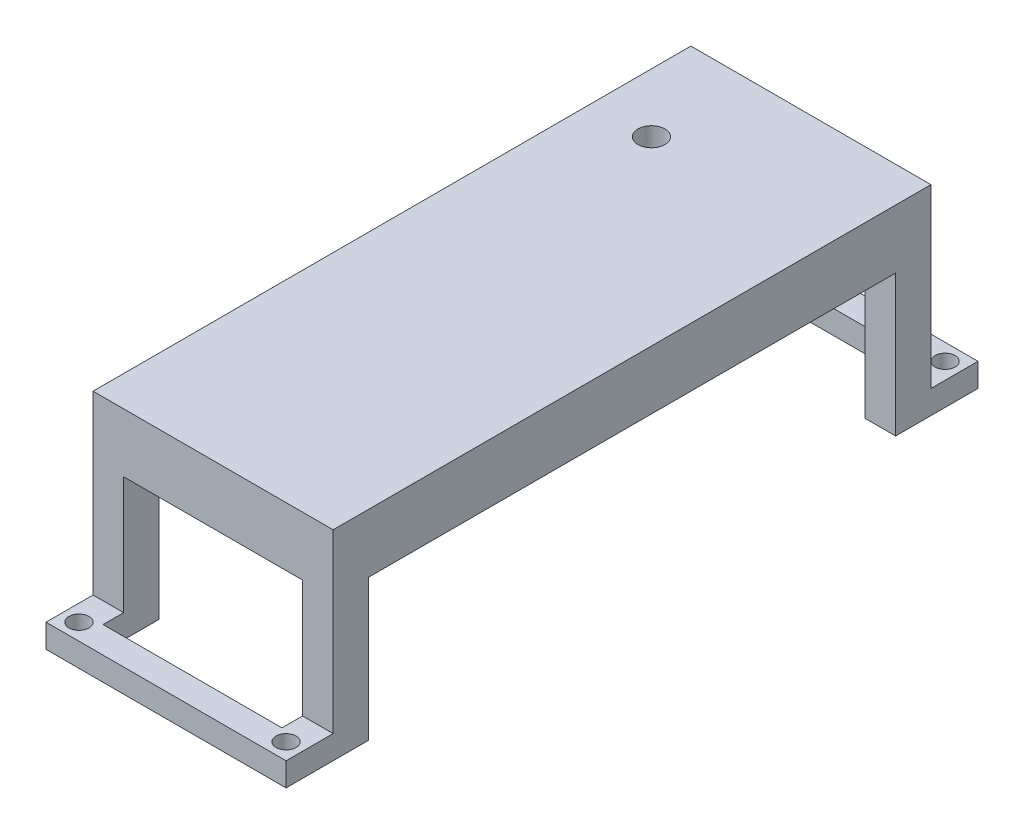
ISO-10303-21;
HEADER;
FILE_DESCRIPTION(('STEP AP214'),'2;1');
FILE_NAME('part.step','',(''),(''),'','','');
FILE_SCHEMA(('AUTOMOTIVE_DESIGN { 1 0 10303 214 1 1 1 1 }'));
ENDSEC;
DATA;
#1=APPLICATION_CONTEXT('core data for automotive mechanical design processes');
#2=APPLICATION_PROTOCOL_DEFINITION('international standard','automotive_design',2000,#1);
#3=PRODUCT_CONTEXT('',#1,'mechanical');
#4=PRODUCT('Part','Part','',(#3));
#5=PRODUCT_RELATED_PRODUCT_CATEGORY('part','',(#4));
#6=PRODUCT_DEFINITION_FORMATION('','',#4);
#7=PRODUCT_DEFINITION_CONTEXT('part definition',#1,'design');
#8=PRODUCT_DEFINITION('design','',#6,#7);
#9=PRODUCT_DEFINITION_SHAPE('','',#8);
#10=(LENGTH_UNIT() NAMED_UNIT(*) SI_UNIT(.MILLI.,.METRE.));
#11=(NAMED_UNIT(*) PLANE_ANGLE_UNIT() SI_UNIT($,.RADIAN.));
#12=(NAMED_UNIT(*) SI_UNIT($,.STERADIAN.) SOLID_ANGLE_UNIT());
#13=UNCERTAINTY_MEASURE_WITH_UNIT(LENGTH_MEASURE(1.E-05),#10,'distance_accuracy_value','');
#14=(GEOMETRIC_REPRESENTATION_CONTEXT(3) GLOBAL_UNCERTAINTY_ASSIGNED_CONTEXT((#13)) GLOBAL_UNIT_ASSIGNED_CONTEXT((#10,
#11,#12)) REPRESENTATION_CONTEXT('',''));
#15=CARTESIAN_POINT('',(0.,0.,0.));
#16=DIRECTION('',(0.,0.,1.));
#17=DIRECTION('',(1.,0.,0.));
#18=AXIS2_PLACEMENT_3D('',#15,#16,#17);
#19=CARTESIAN_POINT('',(0.,0.,23.75));
#20=DIRECTION('',(0.,0.,1.));
#21=DIRECTION('',(1.,0.,0.));
#22=AXIS2_PLACEMENT_3D('',#19,#20,#21);
#23=PLANE('',#22);
#24=DIRECTION('',(1.,0.,0.));
#25=VECTOR('',#24,1.);
#26=CARTESIAN_POINT('',(-51.,60.,23.75));
#27=LINE('',#26,#25);
#28=CARTESIAN_POINT('',(-51.,60.,23.75));
#29=VERTEX_POINT('',#28);
#30=CARTESIAN_POINT('',(-38.,60.,23.75));
#31=VERTEX_POINT('',#30);
#32=EDGE_CURVE('E327',#29,#31,#27,.T.);
#33=ORIENTED_EDGE('',*,*,#32,.F.);
#34=DIRECTION('',(0.,1.,0.));
#35=VECTOR('',#34,1.);
#36=CARTESIAN_POINT('',(-51.,0.,23.75));
#37=LINE('',#36,#35);
#38=CARTESIAN_POINT('',(-51.,0.,23.75));
#39=VERTEX_POINT('',#38);
#40=EDGE_CURVE('E376',#39,#29,#37,.T.);
#41=ORIENTED_EDGE('',*,*,#40,.F.);
#42=DIRECTION('',(1.,0.,0.));
#43=VECTOR('',#42,1.);
#44=CARTESIAN_POINT('',(0.,0.,23.75));
#45=LINE('',#44,#43);
#46=CARTESIAN_POINT('',(-38.,0.,23.75));
#47=VERTEX_POINT('',#46);
#48=EDGE_CURVE('E380',#39,#47,#45,.T.);
#49=ORIENTED_EDGE('',*,*,#48,.T.);
#50=DIRECTION('',(0.,1.,0.));
#51=VECTOR('',#50,1.);
#52=CARTESIAN_POINT('',(-38.,0.,23.75));
#53=LINE('',#52,#51);
#54=EDGE_CURVE('E384',#47,#31,#53,.T.);
#55=ORIENTED_EDGE('',*,*,#54,.T.);
#56=EDGE_LOOP('',(#33,#41,#49,#55));
#57=FACE_BOUND('',#56,.T.);
#58=ADVANCED_FACE('F41',(#57),#23,.T.);
#59=CARTESIAN_POINT('',(0.,10.,0.));
#60=DIRECTION('',(0.,1.,0.));
#61=DIRECTION('',(0.,0.,1.));
#62=AXIS2_PLACEMENT_3D('',#59,#60,#61);
#63=PLANE('',#62);
#64=CARTESIAN_POINT('',(-44.,10.,-4.25000000000001));
#65=DIRECTION('',(0.,1.,0.));
#66=DIRECTION('',(0.,0.,1.));
#67=AXIS2_PLACEMENT_3D('',#64,#65,#66);
#68=CIRCLE('',#67,4.25000000000001);
#69=CARTESIAN_POINT('',(-44.,10.,0.));
#70=VERTEX_POINT('',#69);
#71=EDGE_CURVE('E415',#70,#70,#68,.T.);
#72=ORIENTED_EDGE('',*,*,#71,.F.);
#73=EDGE_LOOP('',(#72));
#74=FACE_BOUND('',#73,.T.);
#75=CARTESIAN_POINT('',(44.,10.,-4.25000000000001));
#76=DIRECTION('',(0.,1.,0.));
#77=DIRECTION('',(0.,0.,-1.));
#78=AXIS2_PLACEMENT_3D('',#75,#76,#77);
#79=CIRCLE('',#78,4.25000000000001);
#80=CARTESIAN_POINT('',(44.,10.,-8.50000000000001));
#81=VERTEX_POINT('',#80);
#82=EDGE_CURVE('E406',#81,#81,#79,.T.);
#83=ORIENTED_EDGE('',*,*,#82,.F.);
#84=EDGE_LOOP('',(#83));
#85=FACE_BOUND('',#84,.T.);
#86=DIRECTION('',(0.,0.,1.));
#87=VECTOR('',#86,1.);
#88=CARTESIAN_POINT('',(-51.,10.,-11.25));
#89=LINE('',#88,#87);
#90=CARTESIAN_POINT('',(-51.,10.,-11.25));
#91=VERTEX_POINT('',#90);
#92=CARTESIAN_POINT('',(-51.,10.,8.74999999999998));
#93=VERTEX_POINT('',#92);
#94=EDGE_CURVE('E423',#91,#93,#89,.T.);
#95=ORIENTED_EDGE('',*,*,#94,.T.);
#96=DIRECTION('',(1.,0.,0.));
#97=VECTOR('',#96,1.);
#98=CARTESIAN_POINT('',(0.,10.,8.74999999999998));
#99=LINE('',#98,#97);
#100=CARTESIAN_POINT('',(-38.,10.,8.74999999999998));
#101=VERTEX_POINT('',#100);
#102=EDGE_CURVE('E405',#93,#101,#99,.T.);
#103=ORIENTED_EDGE('',*,*,#102,.T.);
#104=DIRECTION('',(0.,0.,-1.));
#105=VECTOR('',#104,1.);
#106=CARTESIAN_POINT('',(-38.,10.,13.75));
#107=LINE('',#106,#105);
#108=CARTESIAN_POINT('',(-38.,10.,0.));
#109=VERTEX_POINT('',#108);
#110=EDGE_CURVE('E427',#101,#109,#107,.T.);
#111=ORIENTED_EDGE('',*,*,#110,.T.);
#112=DIRECTION('',(1.,0.,0.));
#113=VECTOR('',#112,1.);
#114=CARTESIAN_POINT('',(-38.,10.,0.));
#115=LINE('',#114,#113);
#116=CARTESIAN_POINT('',(38.,10.,0.));
#117=VERTEX_POINT('',#116);
#118=EDGE_CURVE('E431',#109,#117,#115,.T.);
#119=ORIENTED_EDGE('',*,*,#118,.T.);
#120=DIRECTION('',(0.,0.,1.));
#121=VECTOR('',#120,1.);
#122=CARTESIAN_POINT('',(38.,10.,13.75));
#123=LINE('',#122,#121);
#124=CARTESIAN_POINT('',(38.,10.,8.74999999999998));
#125=VERTEX_POINT('',#124);
#126=EDGE_CURVE('E434',#117,#125,#123,.T.);
#127=ORIENTED_EDGE('',*,*,#126,.T.);
#128=CARTESIAN_POINT('',(51.,10.,8.74999999999998));
#129=VERTEX_POINT('',#128);
#130=EDGE_CURVE('E401',#125,#129,#99,.T.);
#131=ORIENTED_EDGE('',*,*,#130,.T.);
#132=DIRECTION('',(0.,0.,-1.));
#133=VECTOR('',#132,1.);
#134=CARTESIAN_POINT('',(51.,10.,0.));
#135=LINE('',#134,#133);
#136=CARTESIAN_POINT('',(51.,10.,-11.25));
#137=VERTEX_POINT('',#136);
#138=EDGE_CURVE('E438',#129,#137,#135,.T.);
#139=ORIENTED_EDGE('',*,*,#138,.T.);
#140=DIRECTION('',(-1.,0.,0.));
#141=VECTOR('',#140,1.);
#142=CARTESIAN_POINT('',(-51.,10.,-11.25));
#143=LINE('',#142,#141);
#144=EDGE_CURVE('E441',#137,#91,#143,.T.);
#145=ORIENTED_EDGE('',*,*,#144,.T.);
#146=EDGE_LOOP('',(#95,#103,#111,#119,#127,#131,#139,#145));
#147=FACE_BOUND('',#146,.T.);
#148=ADVANCED_FACE('F502',(#74,#85,#147),#63,.T.);
#149=CARTESIAN_POINT('',(0.,0.,0.));
#150=DIRECTION('',(0.,1.,0.));
#151=DIRECTION('',(0.,0.,1.));
#152=AXIS2_PLACEMENT_3D('',#149,#150,#151);
#153=PLANE('',#152);
#154=DIRECTION('',(1.,0.,0.));
#155=VECTOR('',#154,1.);
#156=CARTESIAN_POINT('',(0.,0.,23.75));
#157=LINE('',#156,#155);
#158=CARTESIAN_POINT('',(38.,0.,23.75));
#159=VERTEX_POINT('',#158);
#160=CARTESIAN_POINT('',(51.,0.,23.75));
#161=VERTEX_POINT('',#160);
#162=EDGE_CURVE('E369',#159,#161,#157,.T.);
#163=ORIENTED_EDGE('',*,*,#162,.F.);
#164=DIRECTION('',(0.,0.,1.));
#165=VECTOR('',#164,1.);
#166=CARTESIAN_POINT('',(38.,0.,13.75));
#167=LINE('',#166,#165);
#168=CARTESIAN_POINT('',(38.,0.,0.));
#169=VERTEX_POINT('',#168);
#170=EDGE_CURVE('E453',#169,#159,#167,.T.);
#171=ORIENTED_EDGE('',*,*,#170,.F.);
#172=DIRECTION('',(1.,0.,0.));
#173=VECTOR('',#172,1.);
#174=CARTESIAN_POINT('',(-38.,0.,0.));
#175=LINE('',#174,#173);
#176=CARTESIAN_POINT('',(-38.,0.,0.));
#177=VERTEX_POINT('',#176);
#178=EDGE_CURVE('E450',#177,#169,#175,.T.);
#179=ORIENTED_EDGE('',*,*,#178,.F.);
#180=DIRECTION('',(0.,0.,-1.));
#181=VECTOR('',#180,1.);
#182=CARTESIAN_POINT('',(-38.,0.,13.75));
#183=LINE('',#182,#181);
#184=EDGE_CURVE('E447',#47,#177,#183,.T.);
#185=ORIENTED_EDGE('',*,*,#184,.F.);
#186=ORIENTED_EDGE('',*,*,#48,.F.);
#187=DIRECTION('',(0.,0.,1.));
#188=VECTOR('',#187,1.);
#189=CARTESIAN_POINT('',(-51.,0.,-11.25));
#190=LINE('',#189,#188);
#191=CARTESIAN_POINT('',(-51.,0.,-11.25));
#192=VERTEX_POINT('',#191);
#193=EDGE_CURVE('E419',#192,#39,#190,.T.);
#194=ORIENTED_EDGE('',*,*,#193,.F.);
#195=DIRECTION('',(-1.,0.,0.));
#196=VECTOR('',#195,1.);
#197=CARTESIAN_POINT('',(-51.,0.,-11.25));
#198=LINE('',#197,#196);
#199=CARTESIAN_POINT('',(51.,0.,-11.25));
#200=VERTEX_POINT('',#199);
#201=EDGE_CURVE('E428',#200,#192,#198,.T.);
#202=ORIENTED_EDGE('',*,*,#201,.F.);
#203=DIRECTION('',(0.,0.,-1.));
#204=VECTOR('',#203,1.);
#205=CARTESIAN_POINT('',(51.,0.,-11.25));
#206=LINE('',#205,#204);
#207=EDGE_CURVE('E456',#161,#200,#206,.T.);
#208=ORIENTED_EDGE('',*,*,#207,.F.);
#209=EDGE_LOOP('',(#163,#171,#179,#185,#186,#194,#202,#208));
#210=FACE_BOUND('',#209,.T.);
#211=CARTESIAN_POINT('',(-44.,0.,-4.25000000000001));
#212=DIRECTION('',(0.,1.,0.));
#213=DIRECTION('',(0.,0.,1.));
#214=AXIS2_PLACEMENT_3D('',#211,#212,#213);
#215=CIRCLE('',#214,4.25000000000001);
#216=CARTESIAN_POINT('',(-44.,0.,0.));
#217=VERTEX_POINT('',#216);
#218=EDGE_CURVE('E410',#217,#217,#215,.T.);
#219=ORIENTED_EDGE('',*,*,#218,.T.);
#220=EDGE_LOOP('',(#219));
#221=FACE_BOUND('',#220,.T.);
#222=CARTESIAN_POINT('',(44.,0.,-4.25000000000001));
#223=DIRECTION('',(0.,1.,0.));
#224=DIRECTION('',(0.,0.,-1.));
#225=AXIS2_PLACEMENT_3D('',#222,#223,#224);
#226=CIRCLE('',#225,4.25000000000001);
#227=CARTESIAN_POINT('',(44.,0.,-8.50000000000001));
#228=VERTEX_POINT('',#227);
#229=EDGE_CURVE('E411',#228,#228,#226,.T.);
#230=ORIENTED_EDGE('',*,*,#229,.T.);
#231=EDGE_LOOP('',(#230));
#232=FACE_BOUND('',#231,.T.);
#233=ADVANCED_FACE('F514',(#210,#221,#232),#153,.F.);
#234=CARTESIAN_POINT('',(-51.,10.,-11.25));
#235=DIRECTION('',(1.,0.,0.));
#236=DIRECTION('',(0.,0.,-1.));
#237=AXIS2_PLACEMENT_3D('',#234,#235,#236);
#238=PLANE('',#237);
#239=DIRECTION('',(0.,0.,1.));
#240=VECTOR('',#239,1.);
#241=CARTESIAN_POINT('',(-51.,0.,247.75));
#242=LINE('',#241,#240);
#243=CARTESIAN_POINT('',(-51.,0.,247.75));
#244=VERTEX_POINT('',#243);
#245=CARTESIAN_POINT('',(-51.,0.,282.75));
#246=VERTEX_POINT('',#245);
#247=EDGE_CURVE('E203',#244,#246,#242,.T.);
#248=ORIENTED_EDGE('',*,*,#247,.T.);
#249=DIRECTION('',(0.,-1.,0.));
#250=VECTOR('',#249,1.);
#251=CARTESIAN_POINT('',(-51.,10.,282.75));
#252=LINE('',#251,#250);
#253=CARTESIAN_POINT('',(-51.,10.,282.75));
#254=VERTEX_POINT('',#253);
#255=EDGE_CURVE('E199',#254,#246,#252,.T.);
#256=ORIENTED_EDGE('',*,*,#255,.F.);
#257=DIRECTION('',(0.,0.,-1.));
#258=VECTOR('',#257,1.);
#259=CARTESIAN_POINT('',(-51.,10.,282.75));
#260=LINE('',#259,#258);
#261=CARTESIAN_POINT('',(-51.,10.,262.75));
#262=VERTEX_POINT('',#261);
#263=EDGE_CURVE('E201',#254,#262,#260,.T.);
#264=ORIENTED_EDGE('',*,*,#263,.T.);
#265=DIRECTION('',(0.,1.,0.));
#266=VECTOR('',#265,1.);
#267=CARTESIAN_POINT('',(-51.,0.,262.75));
#268=LINE('',#267,#266);
#269=CARTESIAN_POINT('',(-51.,85.,262.75));
#270=VERTEX_POINT('',#269);
#271=EDGE_CURVE('E60',#262,#270,#268,.T.);
#272=ORIENTED_EDGE('',*,*,#271,.T.);
#273=DIRECTION('',(0.,0.,-1.));
#274=VECTOR('',#273,1.);
#275=CARTESIAN_POINT('',(-51.,85.,23.75));
#276=LINE('',#275,#274);
#277=CARTESIAN_POINT('',(-51.,85.,8.74999999999998));
#278=VERTEX_POINT('',#277);
#279=EDGE_CURVE('E394',#270,#278,#276,.T.);
#280=ORIENTED_EDGE('',*,*,#279,.T.);
#281=DIRECTION('',(0.,1.,0.));
#282=VECTOR('',#281,1.);
#283=CARTESIAN_POINT('',(-51.,0.,8.74999999999998));
#284=LINE('',#283,#282);
#285=EDGE_CURVE('E355',#93,#278,#284,.T.);
#286=ORIENTED_EDGE('',*,*,#285,.F.);
#287=ORIENTED_EDGE('',*,*,#94,.F.);
#288=DIRECTION('',(0.,-1.,0.));
#289=VECTOR('',#288,1.);
#290=CARTESIAN_POINT('',(-51.,10.,-11.25));
#291=LINE('',#290,#289);
#292=EDGE_CURVE('E444',#91,#192,#291,.T.);
#293=ORIENTED_EDGE('',*,*,#292,.T.);
#294=ORIENTED_EDGE('',*,*,#193,.T.);
#295=ORIENTED_EDGE('',*,*,#40,.T.);
#296=DIRECTION('',(0.,0.,-1.));
#297=VECTOR('',#296,1.);
#298=CARTESIAN_POINT('',(-51.,60.,247.75));
#299=LINE('',#298,#297);
#300=CARTESIAN_POINT('',(-51.,60.,247.75));
#301=VERTEX_POINT('',#300);
#302=EDGE_CURVE('E340',#301,#29,#299,.T.);
#303=ORIENTED_EDGE('',*,*,#302,.F.);
#304=DIRECTION('',(0.,1.,0.));
#305=VECTOR('',#304,1.);
#306=CARTESIAN_POINT('',(-51.,0.,247.75));
#307=LINE('',#306,#305);
#308=EDGE_CURVE('E290',#244,#301,#307,.T.);
#309=ORIENTED_EDGE('',*,*,#308,.F.);
#310=EDGE_LOOP('',(#248,#256,#264,#272,#280,#286,#287,#293,#294,#295,#303,#309));
#311=FACE_BOUND('',#310,.T.);
#312=ADVANCED_FACE('F43',(#311),#238,.F.);
#313=CARTESIAN_POINT('',(-38.,10.,13.75));
#314=DIRECTION('',(-1.,0.,0.));
#315=DIRECTION('',(0.,0.,1.));
#316=AXIS2_PLACEMENT_3D('',#313,#314,#315);
#317=PLANE('',#316);
#318=ORIENTED_EDGE('',*,*,#110,.F.);
#319=DIRECTION('',(0.,1.,0.));
#320=VECTOR('',#319,1.);
#321=CARTESIAN_POINT('',(-38.,0.,8.74999999999998));
#322=LINE('',#321,#320);
#323=CARTESIAN_POINT('',(-38.,60.,8.74999999999998));
#324=VERTEX_POINT('',#323);
#325=EDGE_CURVE('E358',#101,#324,#322,.T.);
#326=ORIENTED_EDGE('',*,*,#325,.T.);
#327=DIRECTION('',(0.,0.,-1.));
#328=VECTOR('',#327,1.);
#329=CARTESIAN_POINT('',(-38.,60.,23.75));
#330=LINE('',#329,#328);
#331=EDGE_CURVE('E390',#31,#324,#330,.T.);
#332=ORIENTED_EDGE('',*,*,#331,.F.);
#333=ORIENTED_EDGE('',*,*,#54,.F.);
#334=ORIENTED_EDGE('',*,*,#184,.T.);
#335=DIRECTION('',(0.,-1.,0.));
#336=VECTOR('',#335,1.);
#337=CARTESIAN_POINT('',(-38.,10.,0.));
#338=LINE('',#337,#336);
#339=EDGE_CURVE('E471',#109,#177,#338,.T.);
#340=ORIENTED_EDGE('',*,*,#339,.F.);
#341=EDGE_LOOP('',(#318,#326,#332,#333,#334,#340));
#342=FACE_BOUND('',#341,.T.);
#343=ADVANCED_FACE('F586',(#342),#317,.F.);
#344=CARTESIAN_POINT('',(-38.,10.,0.));
#345=DIRECTION('',(0.,0.,-1.));
#346=DIRECTION('',(-1.,0.,0.));
#347=AXIS2_PLACEMENT_3D('',#344,#345,#346);
#348=PLANE('',#347);
#349=ORIENTED_EDGE('',*,*,#178,.T.);
#350=DIRECTION('',(0.,-1.,0.));
#351=VECTOR('',#350,1.);
#352=CARTESIAN_POINT('',(38.,10.,0.));
#353=LINE('',#352,#351);
#354=EDGE_CURVE('E468',#117,#169,#353,.T.);
#355=ORIENTED_EDGE('',*,*,#354,.F.);
#356=ORIENTED_EDGE('',*,*,#118,.F.);
#357=ORIENTED_EDGE('',*,*,#339,.T.);
#358=EDGE_LOOP('',(#349,#355,#356,#357));
#359=FACE_BOUND('',#358,.T.);
#360=ADVANCED_FACE('F584',(#359),#348,.F.);
#361=CARTESIAN_POINT('',(38.,10.,13.75));
#362=DIRECTION('',(1.,0.,0.));
#363=DIRECTION('',(0.,0.,-1.));
#364=AXIS2_PLACEMENT_3D('',#361,#362,#363);
#365=PLANE('',#364);
#366=DIRECTION('',(0.,-1.,0.));
#367=VECTOR('',#366,1.);
#368=CARTESIAN_POINT('',(38.,0.,8.74999999999998));
#369=LINE('',#368,#367);
#370=CARTESIAN_POINT('',(38.,60.,8.74999999999998));
#371=VERTEX_POINT('',#370);
#372=EDGE_CURVE('E344',#371,#125,#369,.T.);
#373=ORIENTED_EDGE('',*,*,#372,.T.);
#374=ORIENTED_EDGE('',*,*,#126,.F.);
#375=ORIENTED_EDGE('',*,*,#354,.T.);
#376=ORIENTED_EDGE('',*,*,#170,.T.);
#377=DIRECTION('',(0.,-1.,0.));
#378=VECTOR('',#377,1.);
#379=CARTESIAN_POINT('',(38.,0.,23.75));
#380=LINE('',#379,#378);
#381=CARTESIAN_POINT('',(38.,60.,23.75));
#382=VERTEX_POINT('',#381);
#383=EDGE_CURVE('E365',#382,#159,#380,.T.);
#384=ORIENTED_EDGE('',*,*,#383,.F.);
#385=DIRECTION('',(0.,0.,-1.));
#386=VECTOR('',#385,1.);
#387=CARTESIAN_POINT('',(38.,60.,23.75));
#388=LINE('',#387,#386);
#389=EDGE_CURVE('E387',#382,#371,#388,.T.);
#390=ORIENTED_EDGE('',*,*,#389,.T.);
#391=EDGE_LOOP('',(#373,#374,#375,#376,#384,#390));
#392=FACE_BOUND('',#391,.T.);
#393=ADVANCED_FACE('F580',(#392),#365,.F.);
#394=CARTESIAN_POINT('',(51.,10.,-11.25));
#395=DIRECTION('',(-1.,0.,0.));
#396=DIRECTION('',(0.,0.,1.));
#397=AXIS2_PLACEMENT_3D('',#394,#395,#396);
#398=PLANE('',#397);
#399=DIRECTION('',(0.,-1.,0.));
#400=VECTOR('',#399,1.);
#401=CARTESIAN_POINT('',(51.,10.,282.75));
#402=LINE('',#401,#400);
#403=CARTESIAN_POINT('',(51.,10.,282.75));
#404=VERTEX_POINT('',#403);
#405=CARTESIAN_POINT('',(51.,0.,282.75));
#406=VERTEX_POINT('',#405);
#407=EDGE_CURVE('E210',#404,#406,#402,.T.);
#408=ORIENTED_EDGE('',*,*,#407,.T.);
#409=DIRECTION('',(0.,0.,1.));
#410=VECTOR('',#409,1.);
#411=CARTESIAN_POINT('',(51.,0.,247.75));
#412=LINE('',#411,#410);
#413=CARTESIAN_POINT('',(51.,0.,247.75));
#414=VERTEX_POINT('',#413);
#415=EDGE_CURVE('E304',#414,#406,#412,.T.);
#416=ORIENTED_EDGE('',*,*,#415,.F.);
#417=DIRECTION('',(0.,-1.,0.));
#418=VECTOR('',#417,1.);
#419=CARTESIAN_POINT('',(51.,0.,247.75));
#420=LINE('',#419,#418);
#421=CARTESIAN_POINT('',(51.,60.,247.75));
#422=VERTEX_POINT('',#421);
#423=EDGE_CURVE('E294',#422,#414,#420,.T.);
#424=ORIENTED_EDGE('',*,*,#423,.F.);
#425=DIRECTION('',(0.,0.,-1.));
#426=VECTOR('',#425,1.);
#427=CARTESIAN_POINT('',(51.,60.,247.75));
#428=LINE('',#427,#426);
#429=CARTESIAN_POINT('',(51.,60.,23.75));
#430=VERTEX_POINT('',#429);
#431=EDGE_CURVE('E331',#422,#430,#428,.T.);
#432=ORIENTED_EDGE('',*,*,#431,.T.);
#433=DIRECTION('',(0.,-1.,0.));
#434=VECTOR('',#433,1.);
#435=CARTESIAN_POINT('',(51.,0.,23.75));
#436=LINE('',#435,#434);
#437=EDGE_CURVE('E373',#430,#161,#436,.T.);
#438=ORIENTED_EDGE('',*,*,#437,.T.);
#439=ORIENTED_EDGE('',*,*,#207,.T.);
#440=DIRECTION('',(0.,-1.,0.));
#441=VECTOR('',#440,1.);
#442=CARTESIAN_POINT('',(51.,10.,-11.25));
#443=LINE('',#442,#441);
#444=EDGE_CURVE('E464',#137,#200,#443,.T.);
#445=ORIENTED_EDGE('',*,*,#444,.F.);
#446=ORIENTED_EDGE('',*,*,#138,.F.);
#447=DIRECTION('',(0.,-1.,0.));
#448=VECTOR('',#447,1.);
#449=CARTESIAN_POINT('',(51.,0.,8.74999999999998));
#450=LINE('',#449,#448);
#451=CARTESIAN_POINT('',(51.,85.,8.74999999999998));
#452=VERTEX_POINT('',#451);
#453=EDGE_CURVE('E348',#452,#129,#450,.T.);
#454=ORIENTED_EDGE('',*,*,#453,.F.);
#455=DIRECTION('',(0.,0.,-1.));
#456=VECTOR('',#455,1.);
#457=CARTESIAN_POINT('',(51.,85.,23.75));
#458=LINE('',#457,#456);
#459=CARTESIAN_POINT('',(51.,85.,262.75));
#460=VERTEX_POINT('',#459);
#461=EDGE_CURVE('E398',#460,#452,#458,.T.);
#462=ORIENTED_EDGE('',*,*,#461,.F.);
#463=DIRECTION('',(0.,-1.,0.));
#464=VECTOR('',#463,1.);
#465=CARTESIAN_POINT('',(51.,0.,262.75));
#466=LINE('',#465,#464);
#467=CARTESIAN_POINT('',(51.,10.,262.75));
#468=VERTEX_POINT('',#467);
#469=EDGE_CURVE('E274',#460,#468,#466,.T.);
#470=ORIENTED_EDGE('',*,*,#469,.T.);
#471=DIRECTION('',(0.,0.,1.));
#472=VECTOR('',#471,1.);
#473=CARTESIAN_POINT('',(51.,10.,282.75));
#474=LINE('',#473,#472);
#475=EDGE_CURVE('E225',#468,#404,#474,.T.);
#476=ORIENTED_EDGE('',*,*,#475,.T.);
#477=EDGE_LOOP('',(#408,#416,#424,#432,#438,#439,#445,#446,#454,#462,#470,#476));
#478=FACE_BOUND('',#477,.T.);
#479=ADVANCED_FACE('F489',(#478),#398,.F.);
#480=CARTESIAN_POINT('',(-51.,10.,-11.25));
#481=DIRECTION('',(0.,0.,1.));
#482=DIRECTION('',(1.,0.,0.));
#483=AXIS2_PLACEMENT_3D('',#480,#481,#482);
#484=PLANE('',#483);
#485=ORIENTED_EDGE('',*,*,#201,.T.);
#486=ORIENTED_EDGE('',*,*,#292,.F.);
#487=ORIENTED_EDGE('',*,*,#144,.F.);
#488=ORIENTED_EDGE('',*,*,#444,.T.);
#489=EDGE_LOOP('',(#485,#486,#487,#488));
#490=FACE_BOUND('',#489,.T.);
#491=ADVANCED_FACE('F508',(#490),#484,.F.);
#492=CARTESIAN_POINT('',(-44.,10.,-4.25000000000001));
#493=DIRECTION('',(0.,-1.,0.));
#494=DIRECTION('',(0.,0.,-1.));
#495=AXIS2_PLACEMENT_3D('',#492,#493,#494);
#496=CYLINDRICAL_SURFACE('',#495,4.25000000000001);
#497=ORIENTED_EDGE('',*,*,#71,.T.);
#498=EDGE_LOOP('',(#497));
#499=FACE_BOUND('',#498,.T.);
#500=ORIENTED_EDGE('',*,*,#218,.F.);
#501=EDGE_LOOP('',(#500));
#502=FACE_BOUND('',#501,.T.);
#503=ADVANCED_FACE('F601',(#499,#502),#496,.F.);
#504=CARTESIAN_POINT('',(44.,10.,-4.25000000000001));
#505=DIRECTION('',(0.,-1.,0.));
#506=DIRECTION('',(0.,0.,-1.));
#507=AXIS2_PLACEMENT_3D('',#504,#505,#506);
#508=CYLINDRICAL_SURFACE('',#507,4.25000000000001);
#509=ORIENTED_EDGE('',*,*,#82,.T.);
#510=EDGE_LOOP('',(#509));
#511=FACE_BOUND('',#510,.T.);
#512=ORIENTED_EDGE('',*,*,#229,.F.);
#513=EDGE_LOOP('',(#512));
#514=FACE_BOUND('',#513,.T.);
#515=ADVANCED_FACE('F606',(#511,#514),#508,.F.);
#516=CARTESIAN_POINT('',(0.,85.,23.75));
#517=DIRECTION('',(0.,1.,0.));
#518=DIRECTION('',(0.,0.,1.));
#519=AXIS2_PLACEMENT_3D('',#516,#517,#518);
#520=PLANE('',#519);
#521=CARTESIAN_POINT('',(-26.,85.,50.5));
#522=DIRECTION('',(0.,1.,0.));
#523=DIRECTION('',(0.,0.,1.));
#524=AXIS2_PLACEMENT_3D('',#521,#522,#523);
#525=CIRCLE('',#524,5.74999999999999);
#526=CARTESIAN_POINT('',(-26.,85.,56.25));
#527=VERTEX_POINT('',#526);
#528=EDGE_CURVE('E319',#527,#527,#525,.T.);
#529=ORIENTED_EDGE('',*,*,#528,.F.);
#530=EDGE_LOOP('',(#529));
#531=FACE_BOUND('',#530,.T.);
#532=ORIENTED_EDGE('',*,*,#461,.T.);
#533=DIRECTION('',(1.,0.,0.));
#534=VECTOR('',#533,1.);
#535=CARTESIAN_POINT('',(0.,85.,8.74999999999998));
#536=LINE('',#535,#534);
#537=EDGE_CURVE('E351',#278,#452,#536,.T.);
#538=ORIENTED_EDGE('',*,*,#537,.F.);
#539=ORIENTED_EDGE('',*,*,#279,.F.);
#540=DIRECTION('',(1.,0.,0.));
#541=VECTOR('',#540,1.);
#542=CARTESIAN_POINT('',(0.,85.,262.75));
#543=LINE('',#542,#541);
#544=EDGE_CURVE('E270',#270,#460,#543,.T.);
#545=ORIENTED_EDGE('',*,*,#544,.T.);
#546=EDGE_LOOP('',(#532,#538,#539,#545));
#547=FACE_BOUND('',#546,.T.);
#548=ADVANCED_FACE('F494',(#531,#547),#520,.T.);
#549=CARTESIAN_POINT('',(0.,60.,23.75));
#550=DIRECTION('',(0.,1.,0.));
#551=DIRECTION('',(0.,0.,1.));
#552=AXIS2_PLACEMENT_3D('',#549,#550,#551);
#553=PLANE('',#552);
#554=CARTESIAN_POINT('',(-26.,60.,50.5));
#555=DIRECTION('',(0.,1.,0.));
#556=DIRECTION('',(0.,0.,1.));
#557=AXIS2_PLACEMENT_3D('',#554,#555,#556);
#558=CIRCLE('',#557,5.74999999999999);
#559=CARTESIAN_POINT('',(-26.,60.,56.25));
#560=VERTEX_POINT('',#559);
#561=EDGE_CURVE('E323',#560,#560,#558,.F.);
#562=ORIENTED_EDGE('',*,*,#561,.F.);
#563=EDGE_LOOP('',(#562));
#564=FACE_BOUND('',#563,.T.);
#565=ORIENTED_EDGE('',*,*,#331,.T.);
#566=DIRECTION('',(1.,0.,0.));
#567=VECTOR('',#566,1.);
#568=CARTESIAN_POINT('',(0.,60.,8.74999999999998));
#569=LINE('',#568,#567);
#570=EDGE_CURVE('E361',#324,#371,#569,.T.);
#571=ORIENTED_EDGE('',*,*,#570,.T.);
#572=ORIENTED_EDGE('',*,*,#389,.F.);
#573=EDGE_CURVE('E336',#382,#430,#27,.T.);
#574=ORIENTED_EDGE('',*,*,#573,.T.);
#575=ORIENTED_EDGE('',*,*,#431,.F.);
#576=DIRECTION('',(1.,0.,0.));
#577=VECTOR('',#576,1.);
#578=CARTESIAN_POINT('',(-51.,60.,247.75));
#579=LINE('',#578,#577);
#580=CARTESIAN_POINT('',(38.,60.,247.75));
#581=VERTEX_POINT('',#580);
#582=EDGE_CURVE('E332',#581,#422,#579,.T.);
#583=ORIENTED_EDGE('',*,*,#582,.F.);
#584=DIRECTION('',(0.,0.,1.));
#585=VECTOR('',#584,1.);
#586=CARTESIAN_POINT('',(38.,60.,247.75));
#587=LINE('',#586,#585);
#588=CARTESIAN_POINT('',(38.,60.,262.75));
#589=VERTEX_POINT('',#588);
#590=EDGE_CURVE('E316',#581,#589,#587,.T.);
#591=ORIENTED_EDGE('',*,*,#590,.T.);
#592=DIRECTION('',(1.,0.,0.));
#593=VECTOR('',#592,1.);
#594=CARTESIAN_POINT('',(0.,60.,262.75));
#595=LINE('',#594,#593);
#596=CARTESIAN_POINT('',(-38.,60.,262.75));
#597=VERTEX_POINT('',#596);
#598=EDGE_CURVE('E261',#597,#589,#595,.T.);
#599=ORIENTED_EDGE('',*,*,#598,.F.);
#600=DIRECTION('',(0.,0.,1.));
#601=VECTOR('',#600,1.);
#602=CARTESIAN_POINT('',(-38.,60.,247.75));
#603=LINE('',#602,#601);
#604=CARTESIAN_POINT('',(-38.,60.,247.75));
#605=VERTEX_POINT('',#604);
#606=EDGE_CURVE('E312',#605,#597,#603,.T.);
#607=ORIENTED_EDGE('',*,*,#606,.F.);
#608=EDGE_CURVE('E328',#301,#605,#579,.T.);
#609=ORIENTED_EDGE('',*,*,#608,.F.);
#610=ORIENTED_EDGE('',*,*,#302,.T.);
#611=ORIENTED_EDGE('',*,*,#32,.T.);
#612=EDGE_LOOP('',(#565,#571,#572,#574,#575,#583,#591,#599,#607,#609,#610,#611));
#613=FACE_BOUND('',#612,.T.);
#614=ADVANCED_FACE('F521',(#564,#613),#553,.F.);
#615=ORIENTED_EDGE('',*,*,#573,.F.);
#616=ORIENTED_EDGE('',*,*,#383,.T.);
#617=ORIENTED_EDGE('',*,*,#162,.T.);
#618=ORIENTED_EDGE('',*,*,#437,.F.);
#619=EDGE_LOOP('',(#615,#616,#617,#618));
#620=FACE_BOUND('',#619,.T.);
#621=ADVANCED_FACE('F560',(#620),#23,.T.);
#622=CARTESIAN_POINT('',(0.,0.,8.74999999999998));
#623=DIRECTION('',(0.,0.,1.));
#624=DIRECTION('',(1.,0.,0.));
#625=AXIS2_PLACEMENT_3D('',#622,#623,#624);
#626=PLANE('',#625);
#627=ORIENTED_EDGE('',*,*,#102,.F.);
#628=ORIENTED_EDGE('',*,*,#285,.T.);
#629=ORIENTED_EDGE('',*,*,#537,.T.);
#630=ORIENTED_EDGE('',*,*,#453,.T.);
#631=ORIENTED_EDGE('',*,*,#130,.F.);
#632=ORIENTED_EDGE('',*,*,#372,.F.);
#633=ORIENTED_EDGE('',*,*,#570,.F.);
#634=ORIENTED_EDGE('',*,*,#325,.F.);
#635=EDGE_LOOP('',(#627,#628,#629,#630,#631,#632,#633,#634));
#636=FACE_BOUND('',#635,.T.);
#637=ADVANCED_FACE('F497',(#636),#626,.F.);
#638=CARTESIAN_POINT('',(-26.,-0.001000000000001,50.5));
#639=DIRECTION('',(0.,1.,0.));
#640=DIRECTION('',(0.,0.,1.));
#641=AXIS2_PLACEMENT_3D('',#638,#639,#640);
#642=CYLINDRICAL_SURFACE('',#641,5.74999999999999);
#643=ORIENTED_EDGE('',*,*,#528,.T.);
#644=EDGE_LOOP('',(#643));
#645=FACE_BOUND('',#644,.T.);
#646=ORIENTED_EDGE('',*,*,#561,.T.);
#647=EDGE_LOOP('',(#646));
#648=FACE_BOUND('',#647,.T.);
#649=ADVANCED_FACE('F574',(#645,#648),#642,.F.);
#650=CARTESIAN_POINT('',(0.,0.,247.75));
#651=DIRECTION('',(0.,0.,-1.));
#652=DIRECTION('',(1.,0.,0.));
#653=AXIS2_PLACEMENT_3D('',#650,#651,#652);
#654=PLANE('',#653);
#655=ORIENTED_EDGE('',*,*,#308,.T.);
#656=ORIENTED_EDGE('',*,*,#608,.T.);
#657=DIRECTION('',(0.,1.,0.));
#658=VECTOR('',#657,1.);
#659=CARTESIAN_POINT('',(-38.,0.,247.75));
#660=LINE('',#659,#658);
#661=CARTESIAN_POINT('',(-38.,0.,247.75));
#662=VERTEX_POINT('',#661);
#663=EDGE_CURVE('E282',#662,#605,#660,.T.);
#664=ORIENTED_EDGE('',*,*,#663,.F.);
#665=DIRECTION('',(1.,0.,0.));
#666=VECTOR('',#665,1.);
#667=CARTESIAN_POINT('',(0.,0.,247.75));
#668=LINE('',#667,#666);
#669=EDGE_CURVE('E286',#244,#662,#668,.T.);
#670=ORIENTED_EDGE('',*,*,#669,.F.);
#671=EDGE_LOOP('',(#655,#656,#664,#670));
#672=FACE_BOUND('',#671,.T.);
#673=ADVANCED_FACE('F526',(#672),#654,.T.);
#674=CARTESIAN_POINT('',(38.,0.,247.75));
#675=DIRECTION('',(-1.,0.,0.));
#676=DIRECTION('',(0.,-1.,0.));
#677=AXIS2_PLACEMENT_3D('',#674,#675,#676);
#678=PLANE('',#677);
#679=DIRECTION('',(0.,0.,1.));
#680=VECTOR('',#679,1.);
#681=CARTESIAN_POINT('',(38.,0.,247.75));
#682=LINE('',#681,#680);
#683=CARTESIAN_POINT('',(38.,0.,247.75));
#684=VERTEX_POINT('',#683);
#685=CARTESIAN_POINT('',(38.,0.,271.5));
#686=VERTEX_POINT('',#685);
#687=EDGE_CURVE('E301',#684,#686,#682,.T.);
#688=ORIENTED_EDGE('',*,*,#687,.T.);
#689=DIRECTION('',(0.,-1.,0.));
#690=VECTOR('',#689,1.);
#691=CARTESIAN_POINT('',(38.,10.,271.5));
#692=LINE('',#691,#690);
#693=CARTESIAN_POINT('',(38.,10.,271.5));
#694=VERTEX_POINT('',#693);
#695=EDGE_CURVE('E253',#694,#686,#692,.T.);
#696=ORIENTED_EDGE('',*,*,#695,.F.);
#697=DIRECTION('',(0.,0.,-1.));
#698=VECTOR('',#697,1.);
#699=CARTESIAN_POINT('',(38.,10.,257.75));
#700=LINE('',#699,#698);
#701=CARTESIAN_POINT('',(38.,10.,262.75));
#702=VERTEX_POINT('',#701);
#703=EDGE_CURVE('E228',#694,#702,#700,.T.);
#704=ORIENTED_EDGE('',*,*,#703,.T.);
#705=DIRECTION('',(0.,-1.,0.));
#706=VECTOR('',#705,1.);
#707=CARTESIAN_POINT('',(38.,0.,262.75));
#708=LINE('',#707,#706);
#709=EDGE_CURVE('E209',#589,#702,#708,.T.);
#710=ORIENTED_EDGE('',*,*,#709,.F.);
#711=ORIENTED_EDGE('',*,*,#590,.F.);
#712=DIRECTION('',(0.,-1.,0.));
#713=VECTOR('',#712,1.);
#714=CARTESIAN_POINT('',(38.,0.,247.75));
#715=LINE('',#714,#713);
#716=EDGE_CURVE('E278',#581,#684,#715,.T.);
#717=ORIENTED_EDGE('',*,*,#716,.T.);
#718=EDGE_LOOP('',(#688,#696,#704,#710,#711,#717));
#719=FACE_BOUND('',#718,.T.);
#720=ADVANCED_FACE('F542',(#719),#678,.T.);
#721=CARTESIAN_POINT('',(-38.,0.,247.75));
#722=DIRECTION('',(1.,0.,0.));
#723=DIRECTION('',(0.,0.,-1.));
#724=AXIS2_PLACEMENT_3D('',#721,#722,#723);
#725=PLANE('',#724);
#726=DIRECTION('',(0.,-1.,0.));
#727=VECTOR('',#726,1.);
#728=CARTESIAN_POINT('',(-38.,10.,271.5));
#729=LINE('',#728,#727);
#730=CARTESIAN_POINT('',(-38.,10.,271.5));
#731=VERTEX_POINT('',#730);
#732=CARTESIAN_POINT('',(-38.,0.,271.5));
#733=VERTEX_POINT('',#732);
#734=EDGE_CURVE('E242',#731,#733,#729,.T.);
#735=ORIENTED_EDGE('',*,*,#734,.T.);
#736=DIRECTION('',(0.,0.,1.));
#737=VECTOR('',#736,1.);
#738=CARTESIAN_POINT('',(-38.,0.,247.75));
#739=LINE('',#738,#737);
#740=EDGE_CURVE('E309',#662,#733,#739,.T.);
#741=ORIENTED_EDGE('',*,*,#740,.F.);
#742=ORIENTED_EDGE('',*,*,#663,.T.);
#743=ORIENTED_EDGE('',*,*,#606,.T.);
#744=DIRECTION('',(0.,1.,0.));
#745=VECTOR('',#744,1.);
#746=CARTESIAN_POINT('',(-38.,0.,262.75));
#747=LINE('',#746,#745);
#748=CARTESIAN_POINT('',(-38.,10.,262.75));
#749=VERTEX_POINT('',#748);
#750=EDGE_CURVE('E265',#749,#597,#747,.T.);
#751=ORIENTED_EDGE('',*,*,#750,.F.);
#752=DIRECTION('',(0.,0.,1.));
#753=VECTOR('',#752,1.);
#754=CARTESIAN_POINT('',(-38.,10.,257.75));
#755=LINE('',#754,#753);
#756=EDGE_CURVE('E239',#749,#731,#755,.T.);
#757=ORIENTED_EDGE('',*,*,#756,.T.);
#758=EDGE_LOOP('',(#735,#741,#742,#743,#751,#757));
#759=FACE_BOUND('',#758,.T.);
#760=ADVANCED_FACE('F549',(#759),#725,.T.);
#761=CARTESIAN_POINT('',(0.,0.,247.75));
#762=DIRECTION('',(0.,-1.,0.));
#763=DIRECTION('',(0.,0.,-1.));
#764=AXIS2_PLACEMENT_3D('',#761,#762,#763);
#765=PLANE('',#764);
#766=ORIENTED_EDGE('',*,*,#740,.T.);
#767=DIRECTION('',(1.,0.,0.));
#768=VECTOR('',#767,1.);
#769=CARTESIAN_POINT('',(-38.,0.,271.5));
#770=LINE('',#769,#768);
#771=EDGE_CURVE('E219',#733,#686,#770,.T.);
#772=ORIENTED_EDGE('',*,*,#771,.T.);
#773=ORIENTED_EDGE('',*,*,#687,.F.);
#774=DIRECTION('',(1.,0.,0.));
#775=VECTOR('',#774,1.);
#776=CARTESIAN_POINT('',(0.,0.,247.75));
#777=LINE('',#776,#775);
#778=EDGE_CURVE('E297',#684,#414,#777,.T.);
#779=ORIENTED_EDGE('',*,*,#778,.T.);
#780=ORIENTED_EDGE('',*,*,#415,.T.);
#781=DIRECTION('',(-1.,0.,0.));
#782=VECTOR('',#781,1.);
#783=CARTESIAN_POINT('',(-51.,0.,282.75));
#784=LINE('',#783,#782);
#785=EDGE_CURVE('E243',#406,#246,#784,.T.);
#786=ORIENTED_EDGE('',*,*,#785,.T.);
#787=ORIENTED_EDGE('',*,*,#247,.F.);
#788=ORIENTED_EDGE('',*,*,#669,.T.);
#789=EDGE_LOOP('',(#766,#772,#773,#779,#780,#786,#787,#788));
#790=FACE_BOUND('',#789,.T.);
#791=CARTESIAN_POINT('',(44.,0.,275.75));
#792=DIRECTION('',(0.,-1.,0.));
#793=DIRECTION('',(0.,0.,1.));
#794=AXIS2_PLACEMENT_3D('',#791,#792,#793);
#795=CIRCLE('',#794,4.25000000000001);
#796=CARTESIAN_POINT('',(44.,0.,280.));
#797=VERTEX_POINT('',#796);
#798=EDGE_CURVE('E657',#797,#797,#795,.T.);
#799=ORIENTED_EDGE('',*,*,#798,.F.);
#800=EDGE_LOOP('',(#799));
#801=FACE_BOUND('',#800,.T.);
#802=CARTESIAN_POINT('',(-44.,0.,275.75));
#803=DIRECTION('',(0.,-1.,0.));
#804=DIRECTION('',(0.,0.,-1.));
#805=AXIS2_PLACEMENT_3D('',#802,#803,#804);
#806=CIRCLE('',#805,4.25000000000001);
#807=CARTESIAN_POINT('',(-44.,0.,271.5));
#808=VERTEX_POINT('',#807);
#809=EDGE_CURVE('E661',#808,#808,#806,.T.);
#810=ORIENTED_EDGE('',*,*,#809,.F.);
#811=EDGE_LOOP('',(#810));
#812=FACE_BOUND('',#811,.T.);
#813=ADVANCED_FACE('F529',(#790,#801,#812),#765,.T.);
#814=ORIENTED_EDGE('',*,*,#716,.F.);
#815=ORIENTED_EDGE('',*,*,#582,.T.);
#816=ORIENTED_EDGE('',*,*,#423,.T.);
#817=ORIENTED_EDGE('',*,*,#778,.F.);
#818=EDGE_LOOP('',(#814,#815,#816,#817));
#819=FACE_BOUND('',#818,.T.);
#820=ADVANCED_FACE('F537',(#819),#654,.T.);
#821=CARTESIAN_POINT('',(0.,0.,262.75));
#822=DIRECTION('',(0.,0.,-1.));
#823=DIRECTION('',(1.,0.,0.));
#824=AXIS2_PLACEMENT_3D('',#821,#822,#823);
#825=PLANE('',#824);
#826=ORIENTED_EDGE('',*,*,#271,.F.);
#827=DIRECTION('',(1.,0.,0.));
#828=VECTOR('',#827,1.);
#829=CARTESIAN_POINT('',(0.,10.,262.75));
#830=LINE('',#829,#828);
#831=EDGE_CURVE('E11',#262,#749,#830,.T.);
#832=ORIENTED_EDGE('',*,*,#831,.T.);
#833=ORIENTED_EDGE('',*,*,#750,.T.);
#834=ORIENTED_EDGE('',*,*,#598,.T.);
#835=ORIENTED_EDGE('',*,*,#709,.T.);
#836=EDGE_CURVE('E45',#702,#468,#830,.T.);
#837=ORIENTED_EDGE('',*,*,#836,.T.);
#838=ORIENTED_EDGE('',*,*,#469,.F.);
#839=ORIENTED_EDGE('',*,*,#544,.F.);
#840=EDGE_LOOP('',(#826,#832,#833,#834,#835,#837,#838,#839));
#841=FACE_BOUND('',#840,.T.);
#842=ADVANCED_FACE('F485',(#841),#825,.F.);
#843=CARTESIAN_POINT('',(0.,10.,271.5));
#844=DIRECTION('',(0.,1.,0.));
#845=DIRECTION('',(0.,0.,-1.));
#846=AXIS2_PLACEMENT_3D('',#843,#844,#845);
#847=PLANE('',#846);
#848=CARTESIAN_POINT('',(44.,10.,275.75));
#849=DIRECTION('',(0.,-1.,0.));
#850=DIRECTION('',(0.,0.,1.));
#851=AXIS2_PLACEMENT_3D('',#848,#849,#850);
#852=CIRCLE('',#851,4.25000000000001);
#853=CARTESIAN_POINT('',(44.,10.,280.));
#854=VERTEX_POINT('',#853);
#855=EDGE_CURVE('E654',#854,#854,#852,.T.);
#856=ORIENTED_EDGE('',*,*,#855,.T.);
#857=EDGE_LOOP('',(#856));
#858=FACE_BOUND('',#857,.T.);
#859=CARTESIAN_POINT('',(-44.,10.,275.75));
#860=DIRECTION('',(0.,-1.,0.));
#861=DIRECTION('',(0.,0.,-1.));
#862=AXIS2_PLACEMENT_3D('',#859,#860,#861);
#863=CIRCLE('',#862,4.25000000000001);
#864=CARTESIAN_POINT('',(-44.,10.,271.5));
#865=VERTEX_POINT('',#864);
#866=EDGE_CURVE('E246',#865,#865,#863,.T.);
#867=ORIENTED_EDGE('',*,*,#866,.T.);
#868=EDGE_LOOP('',(#867));
#869=FACE_BOUND('',#868,.T.);
#870=ORIENTED_EDGE('',*,*,#831,.F.);
#871=ORIENTED_EDGE('',*,*,#263,.F.);
#872=DIRECTION('',(-1.,0.,0.));
#873=VECTOR('',#872,1.);
#874=CARTESIAN_POINT('',(-51.,10.,282.75));
#875=LINE('',#874,#873);
#876=EDGE_CURVE('E216',#404,#254,#875,.T.);
#877=ORIENTED_EDGE('',*,*,#876,.F.);
#878=ORIENTED_EDGE('',*,*,#475,.F.);
#879=ORIENTED_EDGE('',*,*,#836,.F.);
#880=ORIENTED_EDGE('',*,*,#703,.F.);
#881=DIRECTION('',(1.,0.,0.));
#882=VECTOR('',#881,1.);
#883=CARTESIAN_POINT('',(-38.,10.,271.5));
#884=LINE('',#883,#882);
#885=EDGE_CURVE('E235',#731,#694,#884,.T.);
#886=ORIENTED_EDGE('',*,*,#885,.F.);
#887=ORIENTED_EDGE('',*,*,#756,.F.);
#888=EDGE_LOOP('',(#870,#871,#877,#878,#879,#880,#886,#887));
#889=FACE_BOUND('',#888,.T.);
#890=ADVANCED_FACE('F214',(#858,#869,#889),#847,.T.);
#891=CARTESIAN_POINT('',(-51.,10.,282.75));
#892=DIRECTION('',(0.,0.,1.));
#893=DIRECTION('',(1.,0.,0.));
#894=AXIS2_PLACEMENT_3D('',#891,#892,#893);
#895=PLANE('',#894);
#896=ORIENTED_EDGE('',*,*,#785,.F.);
#897=ORIENTED_EDGE('',*,*,#407,.F.);
#898=ORIENTED_EDGE('',*,*,#876,.T.);
#899=ORIENTED_EDGE('',*,*,#255,.T.);
#900=EDGE_LOOP('',(#896,#897,#898,#899));
#901=FACE_BOUND('',#900,.T.);
#902=ADVANCED_FACE('F222',(#901),#895,.T.);
#903=CARTESIAN_POINT('',(-38.,10.,271.5));
#904=DIRECTION('',(0.,0.,-1.));
#905=DIRECTION('',(-1.,0.,0.));
#906=AXIS2_PLACEMENT_3D('',#903,#904,#905);
#907=PLANE('',#906);
#908=ORIENTED_EDGE('',*,*,#771,.F.);
#909=ORIENTED_EDGE('',*,*,#734,.F.);
#910=ORIENTED_EDGE('',*,*,#885,.T.);
#911=ORIENTED_EDGE('',*,*,#695,.T.);
#912=EDGE_LOOP('',(#908,#909,#910,#911));
#913=FACE_BOUND('',#912,.T.);
#914=ADVANCED_FACE('F547',(#913),#907,.T.);
#915=CARTESIAN_POINT('',(-44.,10.,275.75));
#916=DIRECTION('',(0.,-1.,0.));
#917=DIRECTION('',(0.,0.,-1.));
#918=AXIS2_PLACEMENT_3D('',#915,#916,#917);
#919=CYLINDRICAL_SURFACE('',#918,4.25000000000001);
#920=ORIENTED_EDGE('',*,*,#866,.F.);
#921=EDGE_LOOP('',(#920));
#922=FACE_BOUND('',#921,.T.);
#923=ORIENTED_EDGE('',*,*,#809,.T.);
#924=EDGE_LOOP('',(#923));
#925=FACE_BOUND('',#924,.T.);
#926=ADVANCED_FACE('F641',(#922,#925),#919,.F.);
#927=CARTESIAN_POINT('',(44.,10.,275.75));
#928=DIRECTION('',(0.,-1.,0.));
#929=DIRECTION('',(0.,0.,-1.));
#930=AXIS2_PLACEMENT_3D('',#927,#928,#929);
#931=CYLINDRICAL_SURFACE('',#930,4.25000000000001);
#932=ORIENTED_EDGE('',*,*,#855,.F.);
#933=EDGE_LOOP('',(#932));
#934=FACE_BOUND('',#933,.T.);
#935=ORIENTED_EDGE('',*,*,#798,.T.);
#936=EDGE_LOOP('',(#935));
#937=FACE_BOUND('',#936,.T.);
#938=ADVANCED_FACE('F645',(#934,#937),#931,.F.);
#939=CLOSED_SHELL('',(#58,#148,#233,#312,#343,#360,#393,#479,#491,#503,#515,#548,#614,#621,#637,
#649,#673,#720,#760,#813,#820,#842,#890,#902,#914,#926,#938));
#940=MANIFOLD_SOLID_BREP('B2',#939);
#941=ADVANCED_BREP_SHAPE_REPRESENTATION('',(#18,#940),#14);
#942=SHAPE_DEFINITION_REPRESENTATION(#9,#941);
ENDSEC;
END-ISO-10303-21;
